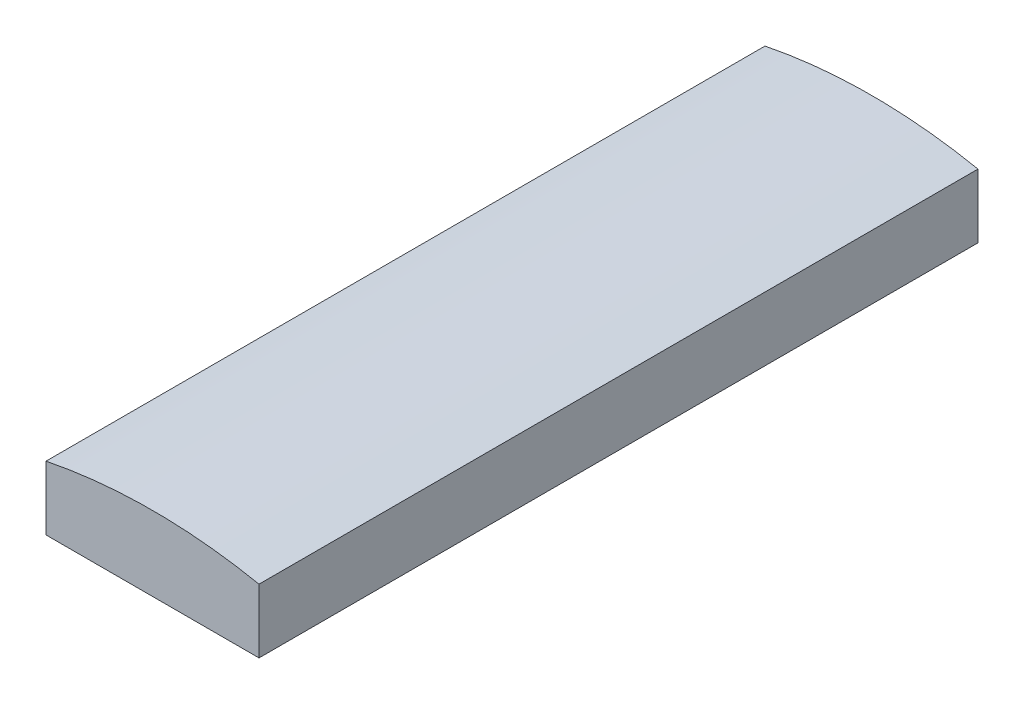
ISO-10303-21;
HEADER;
FILE_DESCRIPTION(('STEP AP214'),'2;1');
FILE_NAME('part.step','',(''),(''),'','','');
FILE_SCHEMA(('AUTOMOTIVE_DESIGN { 1 0 10303 214 1 1 1 1 }'));
ENDSEC;
DATA;
#1=APPLICATION_CONTEXT('core data for automotive mechanical design processes');
#2=APPLICATION_PROTOCOL_DEFINITION('international standard','automotive_design',2000,#1);
#3=PRODUCT_CONTEXT('',#1,'mechanical');
#4=PRODUCT('Part','Part','',(#3));
#5=PRODUCT_RELATED_PRODUCT_CATEGORY('part','',(#4));
#6=PRODUCT_DEFINITION_FORMATION('','',#4);
#7=PRODUCT_DEFINITION_CONTEXT('part definition',#1,'design');
#8=PRODUCT_DEFINITION('design','',#6,#7);
#9=PRODUCT_DEFINITION_SHAPE('','',#8);
#10=(LENGTH_UNIT() NAMED_UNIT(*) SI_UNIT(.MILLI.,.METRE.));
#11=(NAMED_UNIT(*) PLANE_ANGLE_UNIT() SI_UNIT($,.RADIAN.));
#12=(NAMED_UNIT(*) SI_UNIT($,.STERADIAN.) SOLID_ANGLE_UNIT());
#13=UNCERTAINTY_MEASURE_WITH_UNIT(LENGTH_MEASURE(1.E-05),#10,'distance_accuracy_value','');
#14=(GEOMETRIC_REPRESENTATION_CONTEXT(3) GLOBAL_UNCERTAINTY_ASSIGNED_CONTEXT((#13)) GLOBAL_UNIT_ASSIGNED_CONTEXT((#10,
#11,#12)) REPRESENTATION_CONTEXT('',''));
#15=CARTESIAN_POINT('',(0.,0.,0.));
#16=DIRECTION('',(0.,0.,1.));
#17=DIRECTION('',(1.,0.,0.));
#18=AXIS2_PLACEMENT_3D('',#15,#16,#17);
#19=CARTESIAN_POINT('',(0.,0.,67.5));
#20=DIRECTION('',(-1.,0.,0.));
#21=DIRECTION('',(0.,0.,1.));
#22=AXIS2_PLACEMENT_3D('',#19,#20,#21);
#23=PLANE('',#22);
#24=DIRECTION('',(0.,1.,0.));
#25=VECTOR('',#24,1.);
#26=CARTESIAN_POINT('',(0.,0.,0.));
#27=LINE('',#26,#25);
#28=CARTESIAN_POINT('',(0.,0.,0.));
#29=VERTEX_POINT('',#28);
#30=CARTESIAN_POINT('',(0.,6.,0.));
#31=VERTEX_POINT('',#30);
#32=EDGE_CURVE('E99',#29,#31,#27,.T.);
#33=ORIENTED_EDGE('',*,*,#32,.F.);
#34=DIRECTION('',(0.,0.,-1.));
#35=VECTOR('',#34,1.);
#36=CARTESIAN_POINT('',(0.,0.,67.5));
#37=LINE('',#36,#35);
#38=CARTESIAN_POINT('',(0.,0.,67.5));
#39=VERTEX_POINT('',#38);
#40=EDGE_CURVE('E11',#39,#29,#37,.T.);
#41=ORIENTED_EDGE('',*,*,#40,.F.);
#42=DIRECTION('',(0.,1.,0.));
#43=VECTOR('',#42,1.);
#44=CARTESIAN_POINT('',(0.,0.,67.5));
#45=LINE('',#44,#43);
#46=CARTESIAN_POINT('',(0.,6.,67.5));
#47=VERTEX_POINT('',#46);
#48=EDGE_CURVE('E94',#39,#47,#45,.T.);
#49=ORIENTED_EDGE('',*,*,#48,.T.);
#50=DIRECTION('',(0.,0.,-1.));
#51=VECTOR('',#50,1.);
#52=CARTESIAN_POINT('',(0.,6.,67.5));
#53=LINE('',#52,#51);
#54=EDGE_CURVE('E37',#47,#31,#53,.T.);
#55=ORIENTED_EDGE('',*,*,#54,.T.);
#56=EDGE_LOOP('',(#33,#41,#49,#55));
#57=FACE_BOUND('',#56,.T.);
#58=ADVANCED_FACE('F34',(#57),#23,.T.);
#59=CARTESIAN_POINT('',(0.,0.,67.5));
#60=DIRECTION('',(0.,1.,0.));
#61=DIRECTION('',(0.,0.,1.));
#62=AXIS2_PLACEMENT_3D('',#59,#60,#61);
#63=PLANE('',#62);
#64=DIRECTION('',(1.,0.,0.));
#65=VECTOR('',#64,1.);
#66=CARTESIAN_POINT('',(0.,0.,0.));
#67=LINE('',#66,#65);
#68=CARTESIAN_POINT('',(20.,0.,0.));
#69=VERTEX_POINT('',#68);
#70=EDGE_CURVE('E67',#29,#69,#67,.T.);
#71=ORIENTED_EDGE('',*,*,#70,.T.);
#72=DIRECTION('',(0.,0.,-1.));
#73=VECTOR('',#72,1.);
#74=CARTESIAN_POINT('',(20.,0.,67.5));
#75=LINE('',#74,#73);
#76=CARTESIAN_POINT('',(20.,0.,67.5));
#77=VERTEX_POINT('',#76);
#78=EDGE_CURVE('E43',#77,#69,#75,.T.);
#79=ORIENTED_EDGE('',*,*,#78,.F.);
#80=DIRECTION('',(1.,0.,0.));
#81=VECTOR('',#80,1.);
#82=CARTESIAN_POINT('',(0.,0.,67.5));
#83=LINE('',#82,#81);
#84=EDGE_CURVE('E84',#39,#77,#83,.T.);
#85=ORIENTED_EDGE('',*,*,#84,.F.);
#86=ORIENTED_EDGE('',*,*,#40,.T.);
#87=EDGE_LOOP('',(#71,#79,#85,#86));
#88=FACE_BOUND('',#87,.T.);
#89=ADVANCED_FACE('F109',(#88),#63,.F.);
#90=CARTESIAN_POINT('',(20.,0.,67.5));
#91=DIRECTION('',(-1.,0.,0.));
#92=DIRECTION('',(0.,0.,1.));
#93=AXIS2_PLACEMENT_3D('',#90,#91,#92);
#94=PLANE('',#93);
#95=DIRECTION('',(0.,1.,0.));
#96=VECTOR('',#95,1.);
#97=CARTESIAN_POINT('',(20.,0.,0.));
#98=LINE('',#97,#96);
#99=CARTESIAN_POINT('',(20.,6.,0.));
#100=VERTEX_POINT('',#99);
#101=EDGE_CURVE('E91',#69,#100,#98,.T.);
#102=ORIENTED_EDGE('',*,*,#101,.T.);
#103=DIRECTION('',(0.,0.,-1.));
#104=VECTOR('',#103,1.);
#105=CARTESIAN_POINT('',(20.,6.,67.5));
#106=LINE('',#105,#104);
#107=CARTESIAN_POINT('',(20.,6.,67.5));
#108=VERTEX_POINT('',#107);
#109=EDGE_CURVE('E88',#108,#100,#106,.T.);
#110=ORIENTED_EDGE('',*,*,#109,.F.);
#111=DIRECTION('',(0.,1.,0.));
#112=VECTOR('',#111,1.);
#113=CARTESIAN_POINT('',(20.,0.,67.5));
#114=LINE('',#113,#112);
#115=EDGE_CURVE('E79',#77,#108,#114,.T.);
#116=ORIENTED_EDGE('',*,*,#115,.F.);
#117=ORIENTED_EDGE('',*,*,#78,.T.);
#118=EDGE_LOOP('',(#102,#110,#116,#117));
#119=FACE_BOUND('',#118,.T.);
#120=ADVANCED_FACE('F89',(#119),#94,.F.);
#121=CARTESIAN_POINT('',(10.,-43.5,67.5));
#122=DIRECTION('',(0.,0.,-1.));
#123=DIRECTION('',(-1.,0.,0.));
#124=AXIS2_PLACEMENT_3D('',#121,#122,#123);
#125=CYLINDRICAL_SURFACE('',#124,50.5);
#126=CARTESIAN_POINT('',(10.,-43.5,0.));
#127=DIRECTION('',(0.,0.,-1.));
#128=DIRECTION('',(-1.,0.,0.));
#129=AXIS2_PLACEMENT_3D('',#126,#127,#128);
#130=CIRCLE('',#129,50.5);
#131=EDGE_CURVE('E102',#31,#100,#130,.T.);
#132=ORIENTED_EDGE('',*,*,#131,.F.);
#133=ORIENTED_EDGE('',*,*,#54,.F.);
#134=CARTESIAN_POINT('',(10.,-43.5,67.5));
#135=DIRECTION('',(0.,0.,-1.));
#136=DIRECTION('',(-1.,0.,0.));
#137=AXIS2_PLACEMENT_3D('',#134,#135,#136);
#138=CIRCLE('',#137,50.5);
#139=EDGE_CURVE('E83',#47,#108,#138,.T.);
#140=ORIENTED_EDGE('',*,*,#139,.T.);
#141=ORIENTED_EDGE('',*,*,#109,.T.);
#142=EDGE_LOOP('',(#132,#133,#140,#141));
#143=FACE_BOUND('',#142,.T.);
#144=ADVANCED_FACE('F93',(#143),#125,.T.);
#145=CARTESIAN_POINT('',(10.,-43.5,67.5));
#146=DIRECTION('',(0.,0.,-1.));
#147=DIRECTION('',(-1.,0.,0.));
#148=AXIS2_PLACEMENT_3D('',#145,#146,#147);
#149=PLANE('',#148);
#150=ORIENTED_EDGE('',*,*,#48,.F.);
#151=ORIENTED_EDGE('',*,*,#84,.T.);
#152=ORIENTED_EDGE('',*,*,#115,.T.);
#153=ORIENTED_EDGE('',*,*,#139,.F.);
#154=EDGE_LOOP('',(#150,#151,#152,#153));
#155=FACE_BOUND('',#154,.T.);
#156=ADVANCED_FACE('F82',(#155),#149,.F.);
#157=CARTESIAN_POINT('',(10.,-43.5,0.));
#158=DIRECTION('',(0.,0.,-1.));
#159=DIRECTION('',(-1.,0.,0.));
#160=AXIS2_PLACEMENT_3D('',#157,#158,#159);
#161=PLANE('',#160);
#162=ORIENTED_EDGE('',*,*,#32,.T.);
#163=ORIENTED_EDGE('',*,*,#131,.T.);
#164=ORIENTED_EDGE('',*,*,#101,.F.);
#165=ORIENTED_EDGE('',*,*,#70,.F.);
#166=EDGE_LOOP('',(#162,#163,#164,#165));
#167=FACE_BOUND('',#166,.T.);
#168=ADVANCED_FACE('F107',(#167),#161,.T.);
#169=CLOSED_SHELL('',(#58,#89,#120,#144,#156,#168));
#170=MANIFOLD_SOLID_BREP('B2',#169);
#171=ADVANCED_BREP_SHAPE_REPRESENTATION('',(#18,#170),#14);
#172=SHAPE_DEFINITION_REPRESENTATION(#9,#171);
ENDSEC;
END-ISO-10303-21;
